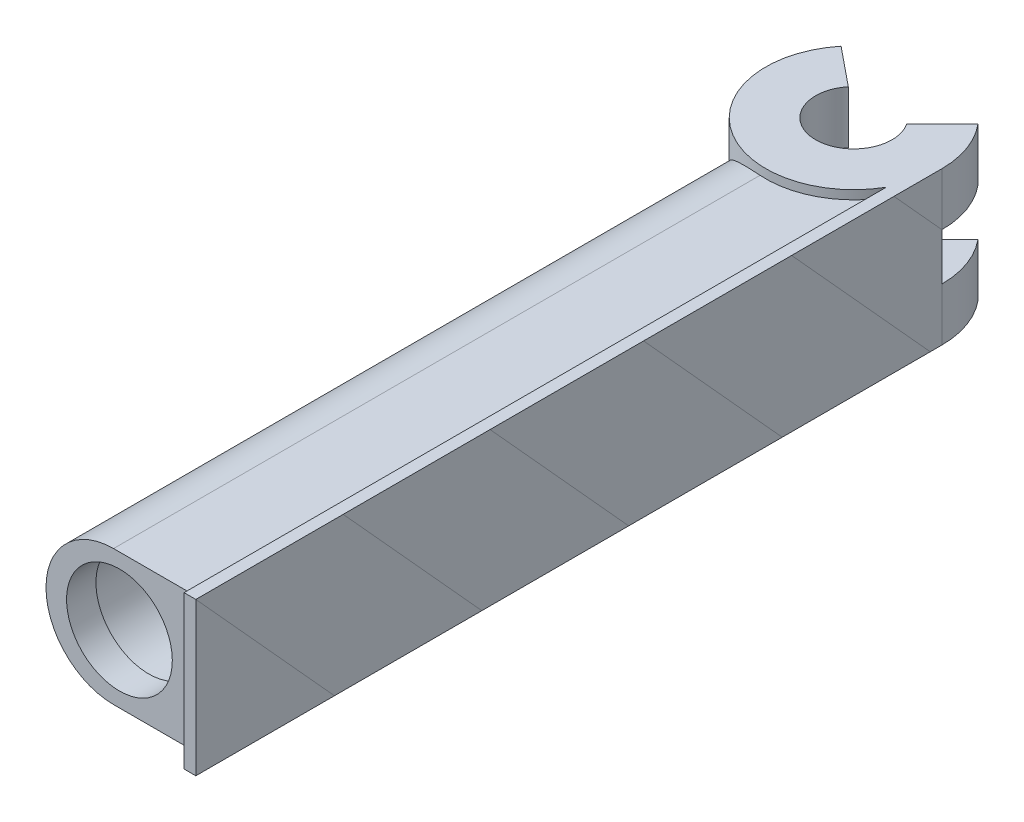
ISO-10303-21;
HEADER;
FILE_DESCRIPTION(('STEP AP214'),'2;1');
FILE_NAME('part.step','',(''),(''),'','','');
FILE_SCHEMA(('AUTOMOTIVE_DESIGN { 1 0 10303 214 1 1 1 1 }'));
ENDSEC;
DATA;
#1=APPLICATION_CONTEXT('core data for automotive mechanical design processes');
#2=APPLICATION_PROTOCOL_DEFINITION('international standard','automotive_design',2000,#1);
#3=PRODUCT_CONTEXT('',#1,'mechanical');
#4=PRODUCT('Part','Part','',(#3));
#5=PRODUCT_RELATED_PRODUCT_CATEGORY('part','',(#4));
#6=PRODUCT_DEFINITION_FORMATION('','',#4);
#7=PRODUCT_DEFINITION_CONTEXT('part definition',#1,'design');
#8=PRODUCT_DEFINITION('design','',#6,#7);
#9=PRODUCT_DEFINITION_SHAPE('','',#8);
#10=(LENGTH_UNIT() NAMED_UNIT(*) SI_UNIT(.MILLI.,.METRE.));
#11=(NAMED_UNIT(*) PLANE_ANGLE_UNIT() SI_UNIT($,.RADIAN.));
#12=(NAMED_UNIT(*) SI_UNIT($,.STERADIAN.) SOLID_ANGLE_UNIT());
#13=UNCERTAINTY_MEASURE_WITH_UNIT(LENGTH_MEASURE(1.E-05),#10,'distance_accuracy_value','');
#14=(GEOMETRIC_REPRESENTATION_CONTEXT(3) GLOBAL_UNCERTAINTY_ASSIGNED_CONTEXT((#13)) GLOBAL_UNIT_ASSIGNED_CONTEXT((#10,
#11,#12)) REPRESENTATION_CONTEXT('',''));
#15=CARTESIAN_POINT('',(0.,0.,0.));
#16=DIRECTION('',(0.,0.,1.));
#17=DIRECTION('',(1.,0.,0.));
#18=AXIS2_PLACEMENT_3D('',#15,#16,#17);
#19=CARTESIAN_POINT('',(0.,26.,0.));
#20=DIRECTION('',(0.,-1.,0.));
#21=DIRECTION('',(0.,0.,-1.));
#22=AXIS2_PLACEMENT_3D('',#19,#20,#21);
#23=CYLINDRICAL_SURFACE('',#22,30.);
#24=CARTESIAN_POINT('',(0.,-26.,0.));
#25=DIRECTION('',(0.,1.,0.));
#26=DIRECTION('',(0.,0.,1.));
#27=AXIS2_PLACEMENT_3D('',#24,#25,#26);
#28=CIRCLE('',#27,30.);
#29=CARTESIAN_POINT('',(30.,-26.,0.));
#30=VERTEX_POINT('',#29);
#31=CARTESIAN_POINT('',(22.9603435149355,-26.,-19.3086153226004));
#32=VERTEX_POINT('',#31);
#33=EDGE_CURVE('E240',#30,#32,#28,.T.);
#34=ORIENTED_EDGE('',*,*,#33,.T.);
#35=DIRECTION('',(0.,1.,0.));
#36=VECTOR('',#35,1.);
#37=CARTESIAN_POINT('',(22.9603435149355,-77.557538277307,-19.3086153226004));
#38=LINE('',#37,#36);
#39=CARTESIAN_POINT('',(22.9603435149355,-8.00000000000004,-19.3086153226004));
#40=VERTEX_POINT('',#39);
#41=EDGE_CURVE('E228',#32,#40,#38,.T.);
#42=ORIENTED_EDGE('',*,*,#41,.T.);
#43=CARTESIAN_POINT('',(0.,-8.,0.));
#44=DIRECTION('',(0.,1.,0.));
#45=DIRECTION('',(0.,0.,1.));
#46=AXIS2_PLACEMENT_3D('',#43,#44,#45);
#47=CIRCLE('',#46,30.);
#48=CARTESIAN_POINT('',(30.,-8.,0.));
#49=VERTEX_POINT('',#48);
#50=EDGE_CURVE('E345',#49,#40,#47,.T.);
#51=ORIENTED_EDGE('',*,*,#50,.F.);
#52=DIRECTION('',(0.,1.,0.));
#53=VECTOR('',#52,1.);
#54=CARTESIAN_POINT('',(30.,26.,0.));
#55=LINE('',#54,#53);
#56=EDGE_CURVE('E405',#30,#49,#55,.T.);
#57=ORIENTED_EDGE('',*,*,#56,.F.);
#58=EDGE_LOOP('',(#34,#42,#51,#57));
#59=FACE_BOUND('',#58,.T.);
#60=ADVANCED_FACE('F53',(#59),#23,.T.);
#61=CARTESIAN_POINT('',(0.,8.,0.));
#62=DIRECTION('',(0.,1.,0.));
#63=DIRECTION('',(0.,0.,1.));
#64=AXIS2_PLACEMENT_3D('',#61,#62,#63);
#65=CIRCLE('',#64,30.);
#66=CARTESIAN_POINT('',(30.,8.00000000000001,0.));
#67=VERTEX_POINT('',#66);
#68=CARTESIAN_POINT('',(22.9603435149355,8.,-19.3086153226004));
#69=VERTEX_POINT('',#68);
#70=EDGE_CURVE('E227',#67,#69,#65,.T.);
#71=ORIENTED_EDGE('',*,*,#70,.T.);
#72=CARTESIAN_POINT('',(22.9603435149355,26.,-19.3086153226004));
#73=VERTEX_POINT('',#72);
#74=EDGE_CURVE('E211',#69,#73,#38,.T.);
#75=ORIENTED_EDGE('',*,*,#74,.T.);
#76=CARTESIAN_POINT('',(0.,26.,0.));
#77=DIRECTION('',(0.,1.,0.));
#78=DIRECTION('',(0.,0.,1.));
#79=AXIS2_PLACEMENT_3D('',#76,#77,#78);
#80=CIRCLE('',#79,30.);
#81=CARTESIAN_POINT('',(30.,26.,0.));
#82=VERTEX_POINT('',#81);
#83=EDGE_CURVE('E225',#82,#73,#80,.T.);
#84=ORIENTED_EDGE('',*,*,#83,.F.);
#85=EDGE_CURVE('E402',#67,#82,#55,.T.);
#86=ORIENTED_EDGE('',*,*,#85,.F.);
#87=EDGE_LOOP('',(#71,#75,#84,#86));
#88=FACE_BOUND('',#87,.T.);
#89=ADVANCED_FACE('F223',(#88),#23,.T.);
#90=CARTESIAN_POINT('',(30.,26.,250.));
#91=DIRECTION('',(-1.,0.,0.));
#92=DIRECTION('',(0.,0.,1.));
#93=AXIS2_PLACEMENT_3D('',#90,#91,#92);
#94=PLANE('',#93);
#95=DIRECTION('',(0.,-0.740455691263407,-0.672105177242096));
#96=VECTOR('',#95,1.);
#97=CARTESIAN_POINT('',(30.,142.284969257166,121.889296184005));
#98=LINE('',#97,#96);
#99=CARTESIAN_POINT('',(30.,26.,16.3384431142877));
#100=VERTEX_POINT('',#99);
#101=EDGE_CURVE('E490',#100,#67,#98,.T.);
#102=ORIENTED_EDGE('',*,*,#101,.F.);
#103=DIRECTION('',(0.,0.,-1.));
#104=VECTOR('',#103,1.);
#105=CARTESIAN_POINT('',(30.,26.,250.));
#106=LINE('',#105,#104);
#107=CARTESIAN_POINT('',(30.,26.,51.1794929681838));
#108=VERTEX_POINT('',#107);
#109=EDGE_CURVE('E527',#108,#100,#106,.T.);
#110=ORIENTED_EDGE('',*,*,#109,.F.);
#111=DIRECTION('',(0.,-0.740455691263407,-0.672105177242096));
#112=VECTOR('',#111,1.);
#113=CARTESIAN_POINT('',(30.,124.945829412569,140.991759926699));
#114=LINE('',#113,#112);
#115=CARTESIAN_POINT('',(30.,-26.,3.97954619357498));
#116=VERTEX_POINT('',#115);
#117=EDGE_CURVE('E487',#108,#116,#114,.T.);
#118=ORIENTED_EDGE('',*,*,#117,.T.);
#119=DIRECTION('',(0.,0.,-1.));
#120=VECTOR('',#119,1.);
#121=CARTESIAN_POINT('',(30.,-26.,250.));
#122=LINE('',#121,#120);
#123=EDGE_CURVE('E418',#116,#30,#122,.T.);
#124=ORIENTED_EDGE('',*,*,#123,.T.);
#125=ORIENTED_EDGE('',*,*,#56,.T.);
#126=EDGE_CURVE('E403',#49,#67,#55,.T.);
#127=ORIENTED_EDGE('',*,*,#126,.T.);
#128=EDGE_LOOP('',(#102,#110,#118,#124,#125,#127));
#129=FACE_BOUND('',#128,.T.);
#130=ADVANCED_FACE('F307',(#129),#94,.F.);
#131=ORIENTED_EDGE('',*,*,#117,.F.);
#132=CARTESIAN_POINT('',(30.,26.,101.57528587291));
#133=VERTEX_POINT('',#132);
#134=EDGE_CURVE('E526',#133,#108,#106,.T.);
#135=ORIENTED_EDGE('',*,*,#134,.F.);
#136=DIRECTION('',(0.,-0.740455691263407,-0.672105177242097));
#137=VECTOR('',#136,1.);
#138=CARTESIAN_POINT('',(30.,99.8656523105951,168.6224946716));
#139=LINE('',#138,#137);
#140=CARTESIAN_POINT('',(30.,-26.,54.3753390983014));
#141=VERTEX_POINT('',#140);
#142=EDGE_CURVE('E484',#133,#141,#139,.T.);
#143=ORIENTED_EDGE('',*,*,#142,.T.);
#144=EDGE_CURVE('E501',#141,#116,#122,.T.);
#145=ORIENTED_EDGE('',*,*,#144,.T.);
#146=EDGE_LOOP('',(#131,#135,#143,#145));
#147=FACE_BOUND('',#146,.T.);
#148=ADVANCED_FACE('F314',(#147),#94,.F.);
#149=ORIENTED_EDGE('',*,*,#142,.F.);
#150=CARTESIAN_POINT('',(30.,26.,153.833181379022));
#151=VERTEX_POINT('',#150);
#152=EDGE_CURVE('E525',#151,#133,#106,.T.);
#153=ORIENTED_EDGE('',*,*,#152,.F.);
#154=DIRECTION('',(0.,-0.740455691263407,-0.672105177242096));
#155=VECTOR('',#154,1.);
#156=CARTESIAN_POINT('',(30.,73.8587735866608,197.274173032646));
#157=LINE('',#156,#155);
#158=CARTESIAN_POINT('',(30.,-26.,106.633234604413));
#159=VERTEX_POINT('',#158);
#160=EDGE_CURVE('E481',#151,#159,#157,.T.);
#161=ORIENTED_EDGE('',*,*,#160,.T.);
#162=EDGE_CURVE('E506',#159,#141,#122,.T.);
#163=ORIENTED_EDGE('',*,*,#162,.T.);
#164=EDGE_LOOP('',(#149,#153,#161,#163));
#165=FACE_BOUND('',#164,.T.);
#166=ADVANCED_FACE('F530',(#165),#94,.F.);
#167=ORIENTED_EDGE('',*,*,#160,.F.);
#168=CARTESIAN_POINT('',(30.,26.,203.833181379022));
#169=VERTEX_POINT('',#168);
#170=EDGE_CURVE('E419',#169,#151,#106,.T.);
#171=ORIENTED_EDGE('',*,*,#170,.F.);
#172=DIRECTION('',(0.,-0.740455691263407,-0.672105177242096));
#173=VECTOR('',#172,1.);
#174=CARTESIAN_POINT('',(30.,48.9755684058353,224.687904568864));
#175=LINE('',#174,#173);
#176=CARTESIAN_POINT('',(30.,-26.,156.633234604413));
#177=VERTEX_POINT('',#176);
#178=EDGE_CURVE('E478',#169,#177,#175,.T.);
#179=ORIENTED_EDGE('',*,*,#178,.T.);
#180=EDGE_CURVE('E507',#177,#159,#122,.T.);
#181=ORIENTED_EDGE('',*,*,#180,.T.);
#182=EDGE_LOOP('',(#167,#171,#179,#181));
#183=FACE_BOUND('',#182,.T.);
#184=ADVANCED_FACE('F529',(#183),#94,.F.);
#185=ORIENTED_EDGE('',*,*,#178,.F.);
#186=CARTESIAN_POINT('',(30.,26.,254.));
#187=VERTEX_POINT('',#186);
#188=EDGE_CURVE('E415',#187,#169,#106,.T.);
#189=ORIENTED_EDGE('',*,*,#188,.F.);
#190=DIRECTION('',(0.,-0.740455691263408,-0.672105177242096));
#191=VECTOR('',#190,1.);
#192=CARTESIAN_POINT('',(30.,24.009343585534,252.193098522898));
#193=LINE('',#192,#191);
#194=CARTESIAN_POINT('',(30.,-26.,206.800053225391));
#195=VERTEX_POINT('',#194);
#196=EDGE_CURVE('E370',#187,#195,#193,.T.);
#197=ORIENTED_EDGE('',*,*,#196,.T.);
#198=EDGE_CURVE('E424',#195,#177,#122,.T.);
#199=ORIENTED_EDGE('',*,*,#198,.T.);
#200=EDGE_LOOP('',(#185,#189,#197,#199));
#201=FACE_BOUND('',#200,.T.);
#202=ADVANCED_FACE('F316',(#201),#94,.F.);
#203=ORIENTED_EDGE('',*,*,#196,.F.);
#204=DIRECTION('',(0.,-1.,0.));
#205=VECTOR('',#204,1.);
#206=CARTESIAN_POINT('',(30.,26.,254.));
#207=LINE('',#206,#205);
#208=CARTESIAN_POINT('',(30.,-26.,254.));
#209=VERTEX_POINT('',#208);
#210=EDGE_CURVE('E363',#187,#209,#207,.T.);
#211=ORIENTED_EDGE('',*,*,#210,.T.);
#212=EDGE_CURVE('E420',#209,#195,#122,.T.);
#213=ORIENTED_EDGE('',*,*,#212,.T.);
#214=EDGE_LOOP('',(#203,#211,#213));
#215=FACE_BOUND('',#214,.T.);
#216=ADVANCED_FACE('F303',(#215),#94,.F.);
#217=CARTESIAN_POINT('',(-2.,0.,250.));
#218=DIRECTION('',(0.,0.,-1.));
#219=DIRECTION('',(-1.,0.,0.));
#220=AXIS2_PLACEMENT_3D('',#217,#218,#219);
#221=PLANE('',#220);
#222=CARTESIAN_POINT('',(0.,0.,250.));
#223=DIRECTION('',(0.,0.,1.));
#224=DIRECTION('',(1.,0.,0.));
#225=AXIS2_PLACEMENT_3D('',#222,#223,#224);
#226=CIRCLE('',#225,18.);
#227=CARTESIAN_POINT('',(18.,0.,250.));
#228=VERTEX_POINT('',#227);
#229=EDGE_CURVE('E355',#228,#228,#226,.T.);
#230=ORIENTED_EDGE('',*,*,#229,.F.);
#231=EDGE_LOOP('',(#230));
#232=FACE_BOUND('',#231,.T.);
#233=DIRECTION('',(0.,-1.,0.));
#234=VECTOR('',#233,1.);
#235=CARTESIAN_POINT('',(26.,26.,250.));
#236=LINE('',#235,#234);
#237=CARTESIAN_POINT('',(26.,23.,250.));
#238=VERTEX_POINT('',#237);
#239=CARTESIAN_POINT('',(26.,-23.,250.));
#240=VERTEX_POINT('',#239);
#241=EDGE_CURVE('E367',#238,#240,#236,.T.);
#242=ORIENTED_EDGE('',*,*,#241,.F.);
#243=DIRECTION('',(-1.,0.,0.));
#244=VECTOR('',#243,1.);
#245=CARTESIAN_POINT('',(-2.,23.,250.));
#246=LINE('',#245,#244);
#247=CARTESIAN_POINT('',(-2.00000000000001,23.,250.));
#248=VERTEX_POINT('',#247);
#249=EDGE_CURVE('E408',#238,#248,#246,.T.);
#250=ORIENTED_EDGE('',*,*,#249,.T.);
#251=CARTESIAN_POINT('',(-2.,0.,250.));
#252=DIRECTION('',(0.,0.,1.));
#253=DIRECTION('',(-1.,0.,0.));
#254=AXIS2_PLACEMENT_3D('',#251,#252,#253);
#255=CIRCLE('',#254,23.);
#256=CARTESIAN_POINT('',(-2.,-23.,250.));
#257=VERTEX_POINT('',#256);
#258=EDGE_CURVE('E410',#248,#257,#255,.T.);
#259=ORIENTED_EDGE('',*,*,#258,.T.);
#260=DIRECTION('',(1.,0.,0.));
#261=VECTOR('',#260,1.);
#262=CARTESIAN_POINT('',(26.,-23.,250.));
#263=LINE('',#262,#261);
#264=EDGE_CURVE('E412',#257,#240,#263,.T.);
#265=ORIENTED_EDGE('',*,*,#264,.T.);
#266=EDGE_LOOP('',(#242,#250,#259,#265));
#267=FACE_BOUND('',#266,.T.);
#268=ADVANCED_FACE('F300',(#232,#267),#221,.F.);
#269=CARTESIAN_POINT('',(-23.2736369469693,-8.,-18.9298130804471));
#270=VERTEX_POINT('',#269);
#271=CARTESIAN_POINT('',(-23.5638586528478,-8.,18.5672982791953));
#272=VERTEX_POINT('',#271);
#273=EDGE_CURVE('E339',#270,#272,#47,.T.);
#274=ORIENTED_EDGE('',*,*,#273,.F.);
#275=DIRECTION('',(0.,1.,0.));
#276=VECTOR('',#275,1.);
#277=CARTESIAN_POINT('',(-23.2736369469693,-77.557538277307,-18.9298130804471));
#278=LINE('',#277,#276);
#279=CARTESIAN_POINT('',(-23.2736369469693,-26.,-18.9298130804471));
#280=VERTEX_POINT('',#279);
#281=EDGE_CURVE('E77',#280,#270,#278,.T.);
#282=ORIENTED_EDGE('',*,*,#281,.F.);
#283=CARTESIAN_POINT('',(26.,-26.,14.9666295470958));
#284=VERTEX_POINT('',#283);
#285=EDGE_CURVE('E246',#280,#284,#28,.T.);
#286=ORIENTED_EDGE('',*,*,#285,.T.);
#287=DIRECTION('',(0.,-1.,0.));
#288=VECTOR('',#287,1.);
#289=CARTESIAN_POINT('',(26.,26.,14.9666295470958));
#290=LINE('',#289,#288);
#291=CARTESIAN_POINT('',(26.,-23.,14.9666295470958));
#292=VERTEX_POINT('',#291);
#293=EDGE_CURVE('E440',#292,#284,#290,.T.);
#294=ORIENTED_EDGE('',*,*,#293,.F.);
#295=CARTESIAN_POINT('',(0.,-23.,0.));
#296=DIRECTION('',(0.,1.,0.));
#297=DIRECTION('',(-1.,0.,0.));
#298=AXIS2_PLACEMENT_3D('',#295,#296,#297);
#299=CIRCLE('',#298,30.);
#300=CARTESIAN_POINT('',(-2.,-23.,29.9332590941915));
#301=VERTEX_POINT('',#300);
#302=EDGE_CURVE('E235',#301,#292,#299,.T.);
#303=ORIENTED_EDGE('',*,*,#302,.F.);
#304=CARTESIAN_POINT('',(-25.,0.,16.583123951777));
#305=CARTESIAN_POINT('',(-24.9999969084999,-0.404391860409273,16.5831317987505));
#306=CARTESIAN_POINT('',(-24.9893070252849,-0.808835476846856,16.5992790008325));
#307=CARTESIAN_POINT('',(-24.9468364833252,-1.61412131052794,16.6630355828786));
#308=CARTESIAN_POINT('',(-24.9150521213389,-2.01496288288905,16.7106504871497));
#309=CARTESIAN_POINT('',(-24.8311405594001,-2.81057914419682,16.8350841693847));
#310=CARTESIAN_POINT('',(-24.7789779750619,-3.20534203216263,16.9119537386022));
#311=CARTESIAN_POINT('',(-24.6554279275674,-3.98595550947442,17.0915683309906));
#312=CARTESIAN_POINT('',(-24.584033561568,-4.37180284467302,17.194322644085));
#313=CARTESIAN_POINT('',(-24.4483655125115,-5.01423549508393,17.386390901835));
#314=CARTESIAN_POINT('',(-24.3888173495588,-5.27359850149702,17.4698993000177));
#315=CARTESIAN_POINT('',(-24.2616235521805,-5.78705822817704,17.6461169897728));
#316=CARTESIAN_POINT('',(-24.1939802446362,-6.04115643724734,17.7388236360827));
#317=CARTESIAN_POINT('',(-23.9793530556328,-6.795708550112,18.029099313703));
#318=CARTESIAN_POINT('',(-23.8207077503598,-7.28825221351236,18.2387724796406));
#319=CARTESIAN_POINT('',(-23.4743535982928,-8.25322988047006,18.6824568185579));
#320=CARTESIAN_POINT('',(-23.2865648407837,-8.72560389673541,18.9165343104311));
#321=CARTESIAN_POINT('',(-22.8839515607127,-9.64958444087979,19.4016521715803));
#322=CARTESIAN_POINT('',(-22.6691277186798,-10.1011914911156,19.6526921138027));
#323=CARTESIAN_POINT('',(-22.2725554425529,-10.8701015042518,20.0997032818435));
#324=CARTESIAN_POINT('',(-22.0966265811876,-11.1919261612332,20.2931207724248));
#325=CARTESIAN_POINT('',(-21.7308546005719,-11.8248447398738,20.6843351426875));
#326=CARTESIAN_POINT('',(-21.5410102844584,-12.1359377351147,20.8821323980475));
#327=CARTESIAN_POINT('',(-20.9508077086762,-13.0535962923796,21.4796827605872));
#328=CARTESIAN_POINT('',(-20.5298393628614,-13.6444264455209,21.8835263152126));
#329=CARTESIAN_POINT('',(-19.6343186960033,-14.7836173170913,22.6904616937574));
#330=CARTESIAN_POINT('',(-19.159796984584,-15.3320019970089,23.0935538145765));
#331=CARTESIAN_POINT('',(-18.1572369562175,-16.3851108853407,23.8898366337976));
#332=CARTESIAN_POINT('',(-17.6292170882665,-16.8898500345028,24.2830306875733));
#333=CARTESIAN_POINT('',(-16.619000352774,-17.7665001619524,24.9823127476461));
#334=CARTESIAN_POINT('',(-16.1454793312362,-18.1460284208634,25.2914094231859));
#335=CARTESIAN_POINT('',(-15.1627295507501,-18.8710180261536,25.8925339243917));
#336=CARTESIAN_POINT('',(-14.6535014377994,-19.2164799885741,26.1845620586794));
#337=CARTESIAN_POINT('',(-13.6008947488468,-19.8696334843786,26.7464222205438));
#338=CARTESIAN_POINT('',(-13.0575650285076,-20.177377267802,27.0162847784931));
#339=CARTESIAN_POINT('',(-11.9376638961835,-20.7518343357419,27.5294623618009));
#340=CARTESIAN_POINT('',(-11.3610990701074,-21.0185557111437,27.7727826193608));
#341=CARTESIAN_POINT('',(-10.2843944102509,-21.4626160249685,28.1868968445652));
#342=CARTESIAN_POINT('',(-9.7892976465013,-21.647395819619,28.3628481646556));
#343=CARTESIAN_POINT('',(-8.78049462224423,-21.9842572921652,28.6911860057779));
#344=CARTESIAN_POINT('',(-8.2667903809955,-22.1363425056856,28.8435750743542));
#345=CARTESIAN_POINT('',(-7.22356677652599,-22.4054546342475,29.1223531524536));
#346=CARTESIAN_POINT('',(-6.69405354360841,-22.5224949494722,29.2487520940632));
#347=CARTESIAN_POINT('',(-5.62228200891144,-22.7195050392317,29.4735424673486));
#348=CARTESIAN_POINT('',(-5.08002355374876,-22.7994743673928,29.5719335617749));
#349=CARTESIAN_POINT('',(-3.98405781819668,-22.9209268369254,29.7394686754605));
#350=CARTESIAN_POINT('',(-3.43030855946204,-22.9622264145305,29.8084723585779));
#351=CARTESIAN_POINT('',(-2.31827379363934,-23.0045274381688,29.9155077576999));
#352=CARTESIAN_POINT('',(-1.75998827537907,-23.0055287849227,29.9535393974009));
#353=CARTESIAN_POINT('',(-0.643632311453427,-22.9667625742224,29.9982963385349));
#354=CARTESIAN_POINT('',(-0.0855618503096781,-22.9269989217319,30.0050246382375));
#355=CARTESIAN_POINT('',(1.02569041271261,-22.8069614336651,29.9876095620428));
#356=CARTESIAN_POINT('',(1.57887243115139,-22.7266894018757,29.9634675606875));
#357=CARTESIAN_POINT('',(2.63427800187295,-22.534175911841,29.888442017219));
#358=CARTESIAN_POINT('',(3.13718712092688,-22.4248172057208,29.839722993466));
#359=CARTESIAN_POINT('',(4.13179130847679,-22.1735025514076,29.7183323189304));
#360=CARTESIAN_POINT('',(4.62348705768615,-22.031548587748,29.6456621262763));
#361=CARTESIAN_POINT('',(5.59294321374261,-21.7165154878687,29.4781448600337));
#362=CARTESIAN_POINT('',(6.07070230434479,-21.5434334227517,29.3832956993351));
#363=CARTESIAN_POINT('',(7.00993707314299,-21.1678269012118,29.1734876266108));
#364=CARTESIAN_POINT('',(7.47141182099344,-20.9653007659845,29.0585275678515));
#365=CARTESIAN_POINT('',(8.4075067911094,-20.517584849303,28.8021758147994));
#366=CARTESIAN_POINT('',(8.880827680732,-20.2704128098468,28.6595057273285));
#367=CARTESIAN_POINT('',(9.80493995663752,-19.7465329345192,28.3566506479143));
#368=CARTESIAN_POINT('',(10.2557305514631,-19.4698240621298,28.1964650413049));
#369=CARTESIAN_POINT('',(11.1336563593822,-18.8887347265996,27.8614882540927));
#370=CARTESIAN_POINT('',(11.5607820616436,-18.5843432658965,27.6866912710249));
#371=CARTESIAN_POINT('',(12.3902704640913,-17.949732098312,27.3255535743004));
#372=CARTESIAN_POINT('',(12.792630124495,-17.6195092321361,27.1392114492035));
#373=CARTESIAN_POINT('',(13.6412725759139,-16.8737670363104,26.7240853062683));
#374=CARTESIAN_POINT('',(14.0826132510706,-16.4535316411891,26.4936536007179));
#375=CARTESIAN_POINT('',(14.9289938037871,-15.5813524647535,26.0261203526379));
#376=CARTESIAN_POINT('',(15.3340285225146,-15.1294041934672,25.7890178685045));
#377=CARTESIAN_POINT('',(16.1072198166262,-14.1949528579215,25.3133098964159));
#378=CARTESIAN_POINT('',(16.4753431779108,-13.7124229011357,25.0747032565349));
#379=CARTESIAN_POINT('',(17.1732313094945,-12.7183326512807,24.6019857936688));
#380=CARTESIAN_POINT('',(17.502999682122,-12.2067750912306,24.3678745501998));
#381=CARTESIAN_POINT('',(18.0998676130669,-11.1943989016269,23.927432145242));
#382=CARTESIAN_POINT('',(18.3697989758664,-10.6955874609367,23.7203273122392));
#383=CARTESIAN_POINT('',(18.8741271037257,-9.6744533230592,23.3210371472899));
#384=CARTESIAN_POINT('',(19.1085224978306,-9.15212971979546,23.1288523910899));
#385=CARTESIAN_POINT('',(19.5394634574702,-8.08588915966983,22.7659532157833));
#386=CARTESIAN_POINT('',(19.7360700955824,-7.54200878781259,22.5952043105743));
#387=CARTESIAN_POINT('',(20.0895006778755,-6.43366101809706,22.2815593040578));
#388=CARTESIAN_POINT('',(20.2463356903567,-5.86919939805278,22.138655456141));
#389=CARTESIAN_POINT('',(20.4901017028854,-4.83899496281234,21.912951505098));
#390=CARTESIAN_POINT('',(20.5847594316099,-4.37645702384061,21.8238395261473));
#391=CARTESIAN_POINT('',(20.7458683222395,-3.44237840542505,21.6707487519141));
#392=CARTESIAN_POINT('',(20.8123231557017,-2.97083890619486,21.6067666852077));
#393=CARTESIAN_POINT('',(20.9158980573504,-2.02213465983438,21.5065207597892));
#394=CARTESIAN_POINT('',(20.9530510038822,-1.54497682892994,21.4702258360678));
#395=CARTESIAN_POINT('',(20.9974739114316,-0.587922607725106,21.426784077034));
#396=CARTESIAN_POINT('',(21.0047435264456,-0.10802618578041,21.4196375792163));
#397=CARTESIAN_POINT('',(20.9892537374136,0.851138431695859,21.4348160259019));
#398=CARTESIAN_POINT('',(20.9664736509524,1.33040596703596,21.4571612687962));
#399=CARTESIAN_POINT('',(20.8912775276442,2.28437713051761,21.5303795586915));
#400=CARTESIAN_POINT('',(20.8388615841071,2.759080773024,21.5812525158716));
#401=CARTESIAN_POINT('',(20.7052077632548,3.70139504223099,21.7095121107362));
#402=CARTESIAN_POINT('',(20.623931604318,4.1689953835232,21.7869339594879));
#403=CARTESIAN_POINT('',(20.433784916763,5.09395133635147,21.9653678550484));
#404=CARTESIAN_POINT('',(20.3249106169365,5.55130553847796,22.0663831256837));
#405=CARTESIAN_POINT('',(20.0430585568613,6.5938283934403,22.3231389928425));
#406=CARTESIAN_POINT('',(19.86067132205,7.1746779820782,22.4861373899462));
#407=CARTESIAN_POINT('',(19.4536965490301,8.31291499163232,22.8391367828579));
#408=CARTESIAN_POINT('',(19.2290950614554,8.87029458233854,23.0291466993378));
#409=CARTESIAN_POINT('',(18.7398404639462,9.96075561699938,23.4290058167281));
#410=CARTESIAN_POINT('',(18.475130190045,10.4938009451816,23.6388831703502));
#411=CARTESIAN_POINT('',(17.9078659538014,11.5337641142509,24.0714678202619));
#412=CARTESIAN_POINT('',(17.6053149102342,12.0406839660227,24.294174126301));
#413=CARTESIAN_POINT('',(16.9557951199268,13.0400059841885,24.7520262296585));
#414=CARTESIAN_POINT('',(16.6079072773335,13.5317314435133,24.9873437212951));
#415=CARTESIAN_POINT('',(15.8750113384696,14.4860602123952,25.4592616968211));
#416=CARTESIAN_POINT('',(15.4900018736537,14.9486624472401,25.695862227708));
#417=CARTESIAN_POINT('',(14.6840590818146,15.8431149945134,26.1647783925261));
#418=CARTESIAN_POINT('',(14.2631511506919,16.2749866565947,26.3970969165147));
#419=CARTESIAN_POINT('',(13.3860421355779,17.106573587561,26.8525238391673));
#420=CARTESIAN_POINT('',(12.9298427810668,17.506290430259,27.075632688337));
#421=CARTESIAN_POINT('',(12.0035507170889,18.2548537221136,27.4984123373608));
#422=CARTESIAN_POINT('',(11.534903249838,18.6051498580144,27.6986787886368));
#423=CARTESIAN_POINT('',(10.567458406401,19.2718446899996,28.0820132941554));
#424=CARTESIAN_POINT('',(10.0686652878873,19.5882481555537,28.2650837678157));
#425=CARTESIAN_POINT('',(9.04260597914621,20.1844703894598,28.6098607220447));
#426=CARTESIAN_POINT('',(8.51534174729988,20.4642916695937,28.7715686694011));
#427=CARTESIAN_POINT('',(7.43470054789466,20.984421367382,29.0695598706205));
#428=CARTESIAN_POINT('',(6.88132379809729,21.2247301144704,29.2058433364602));
#429=CARTESIAN_POINT('',(5.74690105725066,21.6646877318138,29.4501705030967));
#430=CARTESIAN_POINT('',(5.16566045709048,21.8639750942447,29.5579653188251));
#431=CARTESIAN_POINT('',(3.98419350540359,22.2164212375011,29.7402654512815));
#432=CARTESIAN_POINT('',(3.38396692520101,22.3695794624921,29.8147703668871));
#433=CARTESIAN_POINT('',(2.17033413509507,22.6272574439374,29.9275909864285));
#434=CARTESIAN_POINT('',(1.55693995701822,22.7318197780867,29.9659384004874));
#435=CARTESIAN_POINT('',(0.322540505575984,22.890890679977,30.0046173185638));
#436=CARTESIAN_POINT('',(-0.298463563723394,22.9454070651491,30.0049547609342));
#437=CARTESIAN_POINT('',(-1.45296525992114,22.9996876061283,29.9695420642053));
#438=CARTESIAN_POINT('',(-1.9863230429707,23.0061466016856,29.9389272507853));
#439=CARTESIAN_POINT('',(-3.04976994362577,22.9821835630557,29.8493472472413));
#440=CARTESIAN_POINT('',(-3.57985942797196,22.9517657454611,29.790385298869));
#441=CARTESIAN_POINT('',(-4.63286776015827,22.8549251383502,29.6448829529522));
#442=CARTESIAN_POINT('',(-5.15578679357701,22.7885032824654,29.5583432705583));
#443=CARTESIAN_POINT('',(-6.19094735637204,22.6210276260631,29.3589854548077));
#444=CARTESIAN_POINT('',(-6.70318847608479,22.5199724994073,29.2461663152406));
#445=CARTESIAN_POINT('',(-7.7055085805683,22.2869365468531,28.9980567639947));
#446=CARTESIAN_POINT('',(-8.19581429344615,22.1554968667056,28.8631704121713));
#447=CARTESIAN_POINT('',(-9.16069213722405,21.862723633056,28.5715898338653));
#448=CARTESIAN_POINT('',(-9.63526495900615,21.7013913942883,28.4148965665696));
#449=CARTESIAN_POINT('',(-10.5669147391386,21.3507789704273,28.0817576305232));
#450=CARTESIAN_POINT('',(-11.0239879439186,21.1614928312021,27.9053077555905));
#451=CARTESIAN_POINT('',(-11.9191733317298,20.7569594412956,27.5348523336946));
#452=CARTESIAN_POINT('',(-12.3572817657365,20.5417070890788,27.3408433387983));
#453=CARTESIAN_POINT('',(-13.3893806647531,19.9937374633466,26.854608797346));
#454=CARTESIAN_POINT('',(-13.9734943036331,19.6490848865369,26.5547700392061));
#455=CARTESIAN_POINT('',(-15.1001783188955,18.9165856177085,25.9306713750601));
#456=CARTESIAN_POINT('',(-15.6427339685101,18.5287237321595,25.6064028919772));
#457=CARTESIAN_POINT('',(-16.6864677337545,17.7129143781635,24.9388512747451));
#458=CARTESIAN_POINT('',(-17.1875559450539,17.2848838955056,24.5955293897299));
#459=CARTESIAN_POINT('',(-18.1467147234561,16.3924598486416,23.8966278766439));
#460=CARTESIAN_POINT('',(-18.6047901442007,15.9280703981188,23.5410496378077));
#461=CARTESIAN_POINT('',(-19.4849654310937,14.9570178739143,22.8180983403931));
#462=CARTESIAN_POINT('',(-19.9063643590389,14.4497929592023,22.4506275355252));
#463=CARTESIAN_POINT('',(-20.7045924236545,13.4004825065337,21.7166701995927));
#464=CARTESIAN_POINT('',(-21.0814113582329,12.8583890325857,21.3501839125155));
#465=CARTESIAN_POINT('',(-21.7891829767334,11.7399218133518,20.6273355707018));
#466=CARTESIAN_POINT('',(-22.1201953551362,11.1635941094588,20.2709608298121));
#467=CARTESIAN_POINT('',(-22.7352271476857,9.97486497028381,19.5786448469869));
#468=CARTESIAN_POINT('',(-23.0192731178577,9.36248418782376,19.2426921263387));
#469=CARTESIAN_POINT('',(-23.4351454417172,8.34895485335179,18.7311522971208));
#470=CARTESIAN_POINT('',(-23.5828126800658,7.9597938095263,18.5445906158235));
#471=CARTESIAN_POINT('',(-23.858820198784,7.16715343107269,18.1881123856845));
#472=CARTESIAN_POINT('',(-23.9871609866608,6.76367447277292,18.0181953997986));
#473=CARTESIAN_POINT('',(-24.2229236641662,5.94334784143983,17.6999755780962));
#474=CARTESIAN_POINT('',(-24.3303908465967,5.52653145237034,17.551626123862));
#475=CARTESIAN_POINT('',(-24.523134106502,4.67941286482025,17.2813051283459));
#476=CARTESIAN_POINT('',(-24.6084176415032,4.24911525299809,17.1593247248568));
#477=CARTESIAN_POINT('',(-24.7337298175682,3.50370203516126,16.9779554218793));
#478=CARTESIAN_POINT('',(-24.7797062297818,3.1914912761457,16.9106808730103));
#479=CARTESIAN_POINT('',(-24.8590373297732,2.56221069103888,16.7938460908956));
#480=CARTESIAN_POINT('',(-24.8923946358664,2.24514188715618,16.7442821830197));
#481=CARTESIAN_POINT('',(-24.9459766517107,1.60761267812654,16.6643506442116));
#482=CARTESIAN_POINT('',(-24.9662071791928,1.28715383951575,16.6339745095004));
#483=CARTESIAN_POINT('',(-24.9932185552532,0.644474010971369,16.5933603273745));
#484=CARTESIAN_POINT('',(-25.0000024635672,0.322253438652186,16.5831176986486));
#485=CARTESIAN_POINT('',(-25.,0.,16.583123951777));
#486=B_SPLINE_CURVE_WITH_KNOTS('',3,(#304,#305,#306,#307,#308,#309,#310,#311,#312,#313,#314,
#315,#316,#317,#318,#319,#320,#321,#322,#323,#324,#325,#326,#327,#328,#329,#330,#331,#332,#333,
#334,#335,#336,#337,#338,#339,#340,#341,#342,#343,#344,#345,#346,#347,#348,#349,#350,#351,#352,
#353,#354,#355,#356,#357,#358,#359,#360,#361,#362,#363,#364,#365,#366,#367,#368,#369,#370,#371,
#372,#373,#374,#375,#376,#377,#378,#379,#380,#381,#382,#383,#384,#385,#386,#387,#388,#389,#390,
#391,#392,#393,#394,#395,#396,#397,#398,#399,#400,#401,#402,#403,#404,#405,#406,#407,#408,#409,
#410,#411,#412,#413,#414,#415,#416,#417,#418,#419,#420,#421,#422,#423,#424,#425,#426,#427,#428,
#429,#430,#431,#432,#433,#434,#435,#436,#437,#438,#439,#440,#441,#442,#443,#444,#445,#446,#447,
#448,#449,#450,#451,#452,#453,#454,#455,#456,#457,#458,#459,#460,#461,#462,#463,#464,#465,#466,
#467,#468,#469,#470,#471,#472,#473,#474,#475,#476,#477,#478,#479,#480,#481,#482,#483,#484,#485),
.UNSPECIFIED.,.T.,.F.,(4,2,2,2,2,2,2,2,2,2,2,2,2,2,2,2,2,2,2,2,2,2,2,2,2,2,2,2,2,2,2,2,2,2,2,2,
2,2,2,2,2,2,2,2,2,2,2,2,2,2,2,2,2,2,2,2,2,2,2,2,2,2,2,2,2,2,2,2,2,2,2,2,2,2,2,2,2,2,2,2,2,2,2,2,
2,2,2,2,2,2,4),(0.,1.21281510407382,2.42584318027242,3.6409869662718,4.8565674850406,
5.69297263117093,6.52913793451408,8.20200382703086,9.87954047921589,11.5570349127858,
12.8005841638337,14.0442404978816,16.5319907000267,19.0183261063104,21.503806992188,
23.5450838582907,25.5863238039874,27.6247033212839,29.6626802902277,31.331981416573,
33.0011019321203,34.6695834055176,36.3380849686671,38.0144672750943,39.6908537114863,
41.3670795783615,43.043230811607,44.5923960366261,46.1414669670867,47.6906837286558,
49.2399888561565,50.8964803298632,52.5530299529265,54.2102405784989,55.8676542060613,
57.8202887797833,59.7732003713694,61.7278537795607,63.6823234567838,65.4921449159271,
67.3020361790589,69.1089773134713,70.9154150294398,72.3553690257591,73.7951355059992,
75.2332841807232,76.6714495069803,78.1106052010647,79.5497563639253,80.9908236634698,
82.4320879870653,84.3200498892562,86.2086367538646,88.0999410442652,89.991099542395,
91.929391693936,93.8677553309239,95.8047588950035,97.7416675949656,99.5951319996672,
101.448335236159,103.301411162329,105.154471637774,107.023222510331,108.89199589956,
110.759128846254,112.62597008766,114.226802142092,115.827451170404,117.428058693785,
119.028727512679,120.602828385983,122.176860043625,123.751227452105,125.325904679052,
127.547300759188,129.769480420868,131.996358154253,134.222984299952,136.485590481768,
138.748713461474,141.008858822374,143.267721835731,144.635350027884,146.002942300237,
147.367533099292,148.731664566193,149.698987352677,150.666109320883,151.632802371546,
152.599275428994),.UNSPECIFIED.);
#487=EDGE_CURVE('E238',#272,#301,#486,.T.);
#488=ORIENTED_EDGE('',*,*,#487,.F.);
#489=EDGE_LOOP('',(#274,#282,#286,#294,#303,#488));
#490=FACE_BOUND('',#489,.T.);
#491=ADVANCED_FACE('F302',(#490),#23,.T.);
#492=CARTESIAN_POINT('',(0.,-26.,0.));
#493=DIRECTION('',(0.,1.,0.));
#494=DIRECTION('',(0.,0.,1.));
#495=AXIS2_PLACEMENT_3D('',#492,#493,#494);
#496=CYLINDRICAL_SURFACE('',#495,13.);
#497=CARTESIAN_POINT('',(0.,-8.,0.));
#498=DIRECTION('',(0.,1.,0.));
#499=DIRECTION('',(0.,0.,1.));
#500=AXIS2_PLACEMENT_3D('',#497,#498,#499);
#501=CIRCLE('',#500,13.);
#502=CARTESIAN_POINT('',(10.8350938247474,-8.,-7.18336563241222));
#503=VERTEX_POINT('',#502);
#504=CARTESIAN_POINT('',(-10.08524267702,-8.00000000000004,-8.2029190015271));
#505=VERTEX_POINT('',#504);
#506=EDGE_CURVE('E281',#503,#505,#501,.F.);
#507=ORIENTED_EDGE('',*,*,#506,.F.);
#508=DIRECTION('',(0.,1.,0.));
#509=VECTOR('',#508,1.);
#510=CARTESIAN_POINT('',(10.8350938247474,-77.557538277307,-7.18336563241222));
#511=LINE('',#510,#509);
#512=CARTESIAN_POINT('',(10.8350938247474,-26.,-7.18336563241222));
#513=VERTEX_POINT('',#512);
#514=EDGE_CURVE('E69',#513,#503,#511,.T.);
#515=ORIENTED_EDGE('',*,*,#514,.F.);
#516=CARTESIAN_POINT('',(0.,-26.,0.));
#517=DIRECTION('',(0.,1.,0.));
#518=DIRECTION('',(0.,0.,1.));
#519=AXIS2_PLACEMENT_3D('',#516,#517,#518);
#520=CIRCLE('',#519,13.);
#521=CARTESIAN_POINT('',(-10.08524267702,-26.,-8.20291900152709));
#522=VERTEX_POINT('',#521);
#523=EDGE_CURVE('E283',#522,#513,#520,.T.);
#524=ORIENTED_EDGE('',*,*,#523,.F.);
#525=DIRECTION('',(0.,1.,0.));
#526=VECTOR('',#525,1.);
#527=CARTESIAN_POINT('',(-10.08524267702,-77.557538277307,-8.2029190015271));
#528=LINE('',#527,#526);
#529=EDGE_CURVE('E386',#522,#505,#528,.T.);
#530=ORIENTED_EDGE('',*,*,#529,.T.);
#531=EDGE_LOOP('',(#507,#515,#524,#530));
#532=FACE_BOUND('',#531,.T.);
#533=ADVANCED_FACE('F299',(#532),#496,.F.);
#534=CARTESIAN_POINT('',(-23.2736369469693,26.,-18.9298130804471));
#535=VERTEX_POINT('',#534);
#536=CARTESIAN_POINT('',(26.,26.,14.9666295470958));
#537=VERTEX_POINT('',#536);
#538=EDGE_CURVE('E236',#535,#537,#80,.T.);
#539=ORIENTED_EDGE('',*,*,#538,.F.);
#540=CARTESIAN_POINT('',(-23.2736369469693,7.99999999999998,-18.9298130804471));
#541=VERTEX_POINT('',#540);
#542=EDGE_CURVE('E383',#541,#535,#278,.T.);
#543=ORIENTED_EDGE('',*,*,#542,.F.);
#544=CARTESIAN_POINT('',(-23.5638586528478,8.,18.5672982791953));
#545=VERTEX_POINT('',#544);
#546=EDGE_CURVE('E461',#541,#545,#65,.T.);
#547=ORIENTED_EDGE('',*,*,#546,.T.);
#548=CARTESIAN_POINT('',(-2.00000000000001,23.,29.9332590941915));
#549=VERTEX_POINT('',#548);
#550=EDGE_CURVE('E248',#549,#545,#486,.T.);
#551=ORIENTED_EDGE('',*,*,#550,.F.);
#552=CARTESIAN_POINT('',(0.,23.,0.));
#553=DIRECTION('',(0.,-1.,0.));
#554=DIRECTION('',(1.,0.,0.));
#555=AXIS2_PLACEMENT_3D('',#552,#553,#554);
#556=CIRCLE('',#555,30.);
#557=CARTESIAN_POINT('',(26.,23.,14.9666295470958));
#558=VERTEX_POINT('',#557);
#559=EDGE_CURVE('E255',#558,#549,#556,.T.);
#560=ORIENTED_EDGE('',*,*,#559,.F.);
#561=DIRECTION('',(0.,-1.,0.));
#562=VECTOR('',#561,1.);
#563=CARTESIAN_POINT('',(26.,26.,14.9666295470958));
#564=LINE('',#563,#562);
#565=EDGE_CURVE('E243',#537,#558,#564,.T.);
#566=ORIENTED_EDGE('',*,*,#565,.F.);
#567=EDGE_LOOP('',(#539,#543,#547,#551,#560,#566));
#568=FACE_BOUND('',#567,.T.);
#569=ADVANCED_FACE('F55',(#568),#23,.T.);
#570=CARTESIAN_POINT('',(0.,26.,0.));
#571=DIRECTION('',(0.,1.,0.));
#572=DIRECTION('',(0.,0.,1.));
#573=AXIS2_PLACEMENT_3D('',#570,#571,#572);
#574=PLANE('',#573);
#575=DIRECTION('',(0.707106781186546,0.,-0.707106781186549));
#576=VECTOR('',#575,1.);
#577=CARTESIAN_POINT('',(10.8350938247474,26.,-7.18336563241222));
#578=LINE('',#577,#576);
#579=CARTESIAN_POINT('',(10.8350938247474,26.,-7.18336563241222));
#580=VERTEX_POINT('',#579);
#581=EDGE_CURVE('E208',#580,#73,#578,.T.);
#582=ORIENTED_EDGE('',*,*,#581,.F.);
#583=CARTESIAN_POINT('',(0.,26.,0.));
#584=DIRECTION('',(0.,1.,0.));
#585=DIRECTION('',(0.,0.,1.));
#586=AXIS2_PLACEMENT_3D('',#583,#584,#585);
#587=CIRCLE('',#586,13.);
#588=CARTESIAN_POINT('',(-10.08524267702,26.,-8.2029190015271));
#589=VERTEX_POINT('',#588);
#590=EDGE_CURVE('E280',#589,#580,#587,.T.);
#591=ORIENTED_EDGE('',*,*,#590,.F.);
#592=DIRECTION('',(0.775787898232309,0.,0.630993769348238));
#593=VECTOR('',#592,1.);
#594=CARTESIAN_POINT('',(-23.2736369469693,26.,-18.9298130804471));
#595=LINE('',#594,#593);
#596=EDGE_CURVE('E218',#535,#589,#595,.T.);
#597=ORIENTED_EDGE('',*,*,#596,.F.);
#598=ORIENTED_EDGE('',*,*,#538,.T.);
#599=DIRECTION('',(0.,0.,-1.));
#600=VECTOR('',#599,1.);
#601=CARTESIAN_POINT('',(26.,26.,250.));
#602=LINE('',#601,#600);
#603=CARTESIAN_POINT('',(26.,26.,254.));
#604=VERTEX_POINT('',#603);
#605=EDGE_CURVE('E438',#604,#537,#602,.T.);
#606=ORIENTED_EDGE('',*,*,#605,.F.);
#607=DIRECTION('',(1.,0.,0.));
#608=VECTOR('',#607,1.);
#609=CARTESIAN_POINT('',(26.,26.,254.));
#610=LINE('',#609,#608);
#611=EDGE_CURVE('E366',#604,#187,#610,.T.);
#612=ORIENTED_EDGE('',*,*,#611,.T.);
#613=ORIENTED_EDGE('',*,*,#188,.T.);
#614=ORIENTED_EDGE('',*,*,#170,.T.);
#615=ORIENTED_EDGE('',*,*,#152,.T.);
#616=ORIENTED_EDGE('',*,*,#134,.T.);
#617=ORIENTED_EDGE('',*,*,#109,.T.);
#618=EDGE_CURVE('E233',#100,#82,#106,.T.);
#619=ORIENTED_EDGE('',*,*,#618,.T.);
#620=ORIENTED_EDGE('',*,*,#83,.T.);
#621=EDGE_LOOP('',(#582,#591,#597,#598,#606,#612,#613,#614,#615,#616,#617,#619,#620));
#622=FACE_BOUND('',#621,.T.);
#623=ADVANCED_FACE('F230',(#622),#574,.T.);
#624=CARTESIAN_POINT('',(0.,-26.,0.));
#625=DIRECTION('',(0.,1.,0.));
#626=DIRECTION('',(0.,0.,1.));
#627=AXIS2_PLACEMENT_3D('',#624,#625,#626);
#628=PLANE('',#627);
#629=ORIENTED_EDGE('',*,*,#523,.T.);
#630=DIRECTION('',(-0.707106781186546,0.,0.707106781186549));
#631=VECTOR('',#630,1.);
#632=CARTESIAN_POINT('',(10.8350938247474,-26.,-7.18336563241222));
#633=LINE('',#632,#631);
#634=EDGE_CURVE('E380',#32,#513,#633,.T.);
#635=ORIENTED_EDGE('',*,*,#634,.F.);
#636=ORIENTED_EDGE('',*,*,#33,.F.);
#637=ORIENTED_EDGE('',*,*,#123,.F.);
#638=ORIENTED_EDGE('',*,*,#144,.F.);
#639=ORIENTED_EDGE('',*,*,#162,.F.);
#640=ORIENTED_EDGE('',*,*,#180,.F.);
#641=ORIENTED_EDGE('',*,*,#198,.F.);
#642=ORIENTED_EDGE('',*,*,#212,.F.);
#643=DIRECTION('',(1.,0.,0.));
#644=VECTOR('',#643,1.);
#645=CARTESIAN_POINT('',(26.,-26.,254.));
#646=LINE('',#645,#644);
#647=CARTESIAN_POINT('',(26.,-26.,254.));
#648=VERTEX_POINT('',#647);
#649=EDGE_CURVE('E372',#648,#209,#646,.T.);
#650=ORIENTED_EDGE('',*,*,#649,.F.);
#651=DIRECTION('',(0.,0.,-1.));
#652=VECTOR('',#651,1.);
#653=CARTESIAN_POINT('',(26.,-26.,250.));
#654=LINE('',#653,#652);
#655=EDGE_CURVE('E423',#648,#284,#654,.T.);
#656=ORIENTED_EDGE('',*,*,#655,.T.);
#657=ORIENTED_EDGE('',*,*,#285,.F.);
#658=DIRECTION('',(-0.775787898232309,0.,-0.630993769348238));
#659=VECTOR('',#658,1.);
#660=CARTESIAN_POINT('',(-23.2736369469693,-26.,-18.9298130804471));
#661=LINE('',#660,#659);
#662=EDGE_CURVE('E390',#522,#280,#661,.T.);
#663=ORIENTED_EDGE('',*,*,#662,.F.);
#664=EDGE_LOOP('',(#629,#635,#636,#637,#638,#639,#640,#641,#642,#650,#656,#657,#663));
#665=FACE_BOUND('',#664,.T.);
#666=ADVANCED_FACE('F263',(#665),#628,.F.);
#667=CARTESIAN_POINT('',(-2.,0.,250.));
#668=DIRECTION('',(0.,0.,-1.));
#669=DIRECTION('',(-1.,0.,0.));
#670=AXIS2_PLACEMENT_3D('',#667,#668,#669);
#671=CYLINDRICAL_SURFACE('',#670,23.);
#672=DIRECTION('',(0.,0.,-1.));
#673=VECTOR('',#672,1.);
#674=CARTESIAN_POINT('',(-2.00000000000001,23.,250.));
#675=LINE('',#674,#673);
#676=EDGE_CURVE('E432',#248,#549,#675,.T.);
#677=ORIENTED_EDGE('',*,*,#676,.T.);
#678=ORIENTED_EDGE('',*,*,#550,.T.);
#679=CARTESIAN_POINT('',(-23.5638586528478,8.,18.5672982791953));
#680=CARTESIAN_POINT('',(-23.6970786546595,7.64086598786438,18.3982621409826));
#681=CARTESIAN_POINT('',(-23.8223830364675,7.27563567612146,18.2354586988018));
#682=CARTESIAN_POINT('',(-24.0562445835567,6.53255172091618,17.9258053329078));
#683=CARTESIAN_POINT('',(-24.1647752481775,6.15467922694187,17.778980760178));
#684=CARTESIAN_POINT('',(-24.364650592328,5.3835288326477,17.5040864498352));
#685=CARTESIAN_POINT('',(-24.4558307520627,4.99014241841377,17.3761985780172));
#686=CARTESIAN_POINT('',(-24.6183659638315,4.19227504524653,17.1451457858103));
#687=CARTESIAN_POINT('',(-24.6897296533972,3.7877990047559,17.0419700966684));
#688=CARTESIAN_POINT('',(-24.8119358839761,2.96486356771664,16.8635620760182));
#689=CARTESIAN_POINT('',(-24.8625462942376,2.54629981505182,16.7886465464522));
#690=CARTESIAN_POINT('',(-24.94082675442,1.70234907164904,16.672136961693));
#691=CARTESIAN_POINT('',(-24.9684963223272,1.27696193773533,16.6305436066381));
#692=CARTESIAN_POINT('',(-24.9999829606112,0.425659048232727,16.5831746120248));
#693=CARTESIAN_POINT('',(-25.003931491227,-0.000240685863596587,16.5772015686814));
#694=CARTESIAN_POINT('',(-24.988199599167,-0.850569380667011,16.6009061085321));
#695=CARTESIAN_POINT('',(-24.9685213080206,-1.27499847058629,16.6305804757414));
#696=CARTESIAN_POINT('',(-24.9103611540934,-2.06137035437366,16.7175405081982));
#697=CARTESIAN_POINT('',(-24.8747749966466,-2.4240166313327,16.7705599210661));
#698=CARTESIAN_POINT('',(-24.7870896200573,-3.14321964406201,16.8998900743289));
#699=CARTESIAN_POINT('',(-24.7349838587904,-3.49977390820455,16.976210041809));
#700=CARTESIAN_POINT('',(-24.6149703700515,-4.20617528410477,17.1497627280401));
#701=CARTESIAN_POINT('',(-24.5470146323883,-4.55599845059535,17.2470589154295));
#702=CARTESIAN_POINT('',(-24.3963119767548,-5.2469293423067,17.4595799370844));
#703=CARTESIAN_POINT('',(-24.3135620853664,-5.58803529970918,17.5748083748776));
#704=CARTESIAN_POINT('',(-24.1285667875026,-6.28199683132438,17.8280196394154));
#705=CARTESIAN_POINT('',(-24.0254265253077,-6.63425556668171,17.9669741646835));
#706=CARTESIAN_POINT('',(-23.8050384125241,-7.32605783664822,18.2579705858567));
#707=CARTESIAN_POINT('',(-23.6878816707122,-7.66566648927805,18.4099263095239));
#708=CARTESIAN_POINT('',(-23.5638586528478,-8.,18.5672982791953));
#709=B_SPLINE_CURVE_WITH_KNOTS('',3,(#679,#680,#681,#682,#683,#684,#685,#686,#687,#688,#689,
#690,#691,#692,#693,#694,#695,#696,#697,#698,#699,#700,#701,#702,#703,#704,#705,#706,#707,#708),
.UNSPECIFIED.,.F.,.F.,(4,2,2,2,2,2,2,2,2,2,2,2,2,2,4),(0.,1.25618415134419,2.51433308516139,
3.7838746851897,5.0528620502704,6.33567974015701,7.61852438285069,8.89425298792138,
10.1698665098594,11.2733469848578,12.3772650092838,13.4845712952959,14.592100385105,
15.7688050154736,16.9382387811508),.UNSPECIFIED.);
#710=EDGE_CURVE('E271',#545,#272,#709,.T.);
#711=ORIENTED_EDGE('',*,*,#710,.T.);
#712=ORIENTED_EDGE('',*,*,#487,.T.);
#713=DIRECTION('',(0.,0.,-1.));
#714=VECTOR('',#713,1.);
#715=CARTESIAN_POINT('',(-2.,-23.,250.));
#716=LINE('',#715,#714);
#717=EDGE_CURVE('E429',#257,#301,#716,.T.);
#718=ORIENTED_EDGE('',*,*,#717,.F.);
#719=ORIENTED_EDGE('',*,*,#258,.F.);
#720=EDGE_LOOP('',(#677,#678,#711,#712,#718,#719));
#721=FACE_BOUND('',#720,.T.);
#722=ADVANCED_FACE('F257',(#721),#671,.T.);
#723=CARTESIAN_POINT('',(26.,23.,250.));
#724=DIRECTION('',(1.,0.,0.));
#725=DIRECTION('',(0.,0.,-1.));
#726=AXIS2_PLACEMENT_3D('',#723,#724,#725);
#727=PLANE('',#726);
#728=ORIENTED_EDGE('',*,*,#605,.T.);
#729=ORIENTED_EDGE('',*,*,#565,.T.);
#730=DIRECTION('',(0.,0.,-1.));
#731=VECTOR('',#730,1.);
#732=CARTESIAN_POINT('',(26.,23.,250.));
#733=LINE('',#732,#731);
#734=EDGE_CURVE('E435',#238,#558,#733,.T.);
#735=ORIENTED_EDGE('',*,*,#734,.F.);
#736=ORIENTED_EDGE('',*,*,#241,.T.);
#737=DIRECTION('',(0.,0.,-1.));
#738=VECTOR('',#737,1.);
#739=CARTESIAN_POINT('',(26.,-23.,250.));
#740=LINE('',#739,#738);
#741=EDGE_CURVE('E426',#240,#292,#740,.T.);
#742=ORIENTED_EDGE('',*,*,#741,.T.);
#743=ORIENTED_EDGE('',*,*,#293,.T.);
#744=ORIENTED_EDGE('',*,*,#655,.F.);
#745=DIRECTION('',(0.,-1.,0.));
#746=VECTOR('',#745,1.);
#747=CARTESIAN_POINT('',(26.,26.,254.));
#748=LINE('',#747,#746);
#749=EDGE_CURVE('E358',#604,#648,#748,.T.);
#750=ORIENTED_EDGE('',*,*,#749,.F.);
#751=EDGE_LOOP('',(#728,#729,#735,#736,#742,#743,#744,#750));
#752=FACE_BOUND('',#751,.T.);
#753=ADVANCED_FACE('F262',(#752),#727,.F.);
#754=CARTESIAN_POINT('',(-2.,23.,250.));
#755=DIRECTION('',(0.,-1.,0.));
#756=DIRECTION('',(1.,0.,0.));
#757=AXIS2_PLACEMENT_3D('',#754,#755,#756);
#758=PLANE('',#757);
#759=ORIENTED_EDGE('',*,*,#734,.T.);
#760=ORIENTED_EDGE('',*,*,#559,.T.);
#761=ORIENTED_EDGE('',*,*,#676,.F.);
#762=ORIENTED_EDGE('',*,*,#249,.F.);
#763=EDGE_LOOP('',(#759,#760,#761,#762));
#764=FACE_BOUND('',#763,.T.);
#765=ADVANCED_FACE('F267',(#764),#758,.F.);
#766=CARTESIAN_POINT('',(26.,-23.,250.));
#767=DIRECTION('',(0.,1.,0.));
#768=DIRECTION('',(-1.,0.,0.));
#769=AXIS2_PLACEMENT_3D('',#766,#767,#768);
#770=PLANE('',#769);
#771=ORIENTED_EDGE('',*,*,#717,.T.);
#772=ORIENTED_EDGE('',*,*,#302,.T.);
#773=ORIENTED_EDGE('',*,*,#741,.F.);
#774=ORIENTED_EDGE('',*,*,#264,.F.);
#775=EDGE_LOOP('',(#771,#772,#773,#774));
#776=FACE_BOUND('',#775,.T.);
#777=ADVANCED_FACE('F265',(#776),#770,.F.);
#778=ORIENTED_EDGE('',*,*,#618,.F.);
#779=ORIENTED_EDGE('',*,*,#101,.T.);
#780=ORIENTED_EDGE('',*,*,#85,.T.);
#781=EDGE_LOOP('',(#778,#779,#780));
#782=FACE_BOUND('',#781,.T.);
#783=ADVANCED_FACE('F297',(#782),#94,.F.);
#784=ORIENTED_EDGE('',*,*,#590,.T.);
#785=CARTESIAN_POINT('',(10.8350938247474,7.99999999999998,-7.18336563241222));
#786=VERTEX_POINT('',#785);
#787=EDGE_CURVE('E213',#786,#580,#511,.T.);
#788=ORIENTED_EDGE('',*,*,#787,.F.);
#789=CARTESIAN_POINT('',(0.,8.,0.));
#790=DIRECTION('',(0.,1.,0.));
#791=DIRECTION('',(0.,0.,1.));
#792=AXIS2_PLACEMENT_3D('',#789,#790,#791);
#793=CIRCLE('',#792,13.);
#794=CARTESIAN_POINT('',(-10.08524267702,8.,-8.20291900152709));
#795=VERTEX_POINT('',#794);
#796=EDGE_CURVE('E348',#786,#795,#793,.F.);
#797=ORIENTED_EDGE('',*,*,#796,.T.);
#798=EDGE_CURVE('E385',#795,#589,#528,.T.);
#799=ORIENTED_EDGE('',*,*,#798,.T.);
#800=EDGE_LOOP('',(#784,#788,#797,#799));
#801=FACE_BOUND('',#800,.T.);
#802=ADVANCED_FACE('F291',(#801),#496,.F.);
#803=CARTESIAN_POINT('',(0.,-8.,0.));
#804=DIRECTION('',(0.,1.,0.));
#805=DIRECTION('',(0.,0.,1.));
#806=AXIS2_PLACEMENT_3D('',#803,#804,#805);
#807=CYLINDRICAL_SURFACE('',#806,30.);
#808=EDGE_CURVE('E353',#545,#67,#65,.T.);
#809=ORIENTED_EDGE('',*,*,#808,.T.);
#810=ORIENTED_EDGE('',*,*,#126,.F.);
#811=EDGE_CURVE('E346',#272,#49,#47,.T.);
#812=ORIENTED_EDGE('',*,*,#811,.F.);
#813=ORIENTED_EDGE('',*,*,#710,.F.);
#814=EDGE_LOOP('',(#809,#810,#812,#813));
#815=FACE_BOUND('',#814,.T.);
#816=ADVANCED_FACE('F285',(#815),#807,.F.);
#817=CARTESIAN_POINT('',(0.,-8.,0.));
#818=DIRECTION('',(0.,1.,0.));
#819=DIRECTION('',(0.,0.,1.));
#820=AXIS2_PLACEMENT_3D('',#817,#818,#819);
#821=PLANE('',#820);
#822=DIRECTION('',(0.707106781186546,0.,-0.707106781186549));
#823=VECTOR('',#822,1.);
#824=CARTESIAN_POINT('',(1.8258640961676,-8.,1.8258640961676));
#825=LINE('',#824,#823);
#826=EDGE_CURVE('E375',#503,#40,#825,.T.);
#827=ORIENTED_EDGE('',*,*,#826,.F.);
#828=ORIENTED_EDGE('',*,*,#506,.T.);
#829=DIRECTION('',(0.775787898232309,0.,0.630993769348238));
#830=VECTOR('',#829,1.);
#831=CARTESIAN_POINT('',(0.,-8.,0.));
#832=LINE('',#831,#830);
#833=EDGE_CURVE('E379',#270,#505,#832,.T.);
#834=ORIENTED_EDGE('',*,*,#833,.F.);
#835=ORIENTED_EDGE('',*,*,#273,.T.);
#836=ORIENTED_EDGE('',*,*,#811,.T.);
#837=ORIENTED_EDGE('',*,*,#50,.T.);
#838=EDGE_LOOP('',(#827,#828,#834,#835,#836,#837));
#839=FACE_BOUND('',#838,.T.);
#840=ADVANCED_FACE('F290',(#839),#821,.T.);
#841=CARTESIAN_POINT('',(0.,8.,0.));
#842=DIRECTION('',(0.,1.,0.));
#843=DIRECTION('',(0.,0.,1.));
#844=AXIS2_PLACEMENT_3D('',#841,#842,#843);
#845=PLANE('',#844);
#846=ORIENTED_EDGE('',*,*,#796,.F.);
#847=DIRECTION('',(0.707106781186546,0.,-0.707106781186549));
#848=VECTOR('',#847,1.);
#849=CARTESIAN_POINT('',(1.8258640961676,8.,1.8258640961676));
#850=LINE('',#849,#848);
#851=EDGE_CURVE('E11',#786,#69,#850,.T.);
#852=ORIENTED_EDGE('',*,*,#851,.T.);
#853=ORIENTED_EDGE('',*,*,#70,.F.);
#854=ORIENTED_EDGE('',*,*,#808,.F.);
#855=ORIENTED_EDGE('',*,*,#546,.F.);
#856=DIRECTION('',(0.775787898232309,0.,0.630993769348238));
#857=VECTOR('',#856,1.);
#858=CARTESIAN_POINT('',(0.,8.,0.));
#859=LINE('',#858,#857);
#860=EDGE_CURVE('E62',#541,#795,#859,.T.);
#861=ORIENTED_EDGE('',*,*,#860,.T.);
#862=EDGE_LOOP('',(#846,#852,#853,#854,#855,#861));
#863=FACE_BOUND('',#862,.T.);
#864=ADVANCED_FACE('F293',(#863),#845,.F.);
#865=CARTESIAN_POINT('',(0.,0.,240.));
#866=DIRECTION('',(0.,0.,1.));
#867=DIRECTION('',(1.,0.,0.));
#868=AXIS2_PLACEMENT_3D('',#865,#866,#867);
#869=CYLINDRICAL_SURFACE('',#868,18.);
#870=CARTESIAN_POINT('',(0.,0.,240.));
#871=DIRECTION('',(0.,0.,1.));
#872=DIRECTION('',(1.,0.,0.));
#873=AXIS2_PLACEMENT_3D('',#870,#871,#872);
#874=CIRCLE('',#873,18.);
#875=CARTESIAN_POINT('',(18.,0.,240.));
#876=VERTEX_POINT('',#875);
#877=EDGE_CURVE('E354',#876,#876,#874,.T.);
#878=ORIENTED_EDGE('',*,*,#877,.F.);
#879=EDGE_LOOP('',(#878));
#880=FACE_BOUND('',#879,.T.);
#881=ORIENTED_EDGE('',*,*,#229,.T.);
#882=EDGE_LOOP('',(#881));
#883=FACE_BOUND('',#882,.T.);
#884=ADVANCED_FACE('F653',(#880,#883),#869,.F.);
#885=CARTESIAN_POINT('',(0.,0.,240.));
#886=DIRECTION('',(0.,0.,1.));
#887=DIRECTION('',(1.,0.,0.));
#888=AXIS2_PLACEMENT_3D('',#885,#886,#887);
#889=PLANE('',#888);
#890=ORIENTED_EDGE('',*,*,#877,.T.);
#891=EDGE_LOOP('',(#890));
#892=FACE_BOUND('',#891,.T.);
#893=CARTESIAN_POINT('',(0.,0.,240.));
#894=DIRECTION('',(0.,0.,1.));
#895=DIRECTION('',(1.,0.,0.));
#896=AXIS2_PLACEMENT_3D('',#893,#894,#895);
#897=CIRCLE('',#896,19.);
#898=CARTESIAN_POINT('',(19.,0.,240.));
#899=VERTEX_POINT('',#898);
#900=EDGE_CURVE('E371',#899,#899,#897,.F.);
#901=ORIENTED_EDGE('',*,*,#900,.T.);
#902=EDGE_LOOP('',(#901));
#903=FACE_BOUND('',#902,.T.);
#904=ADVANCED_FACE('F649',(#892,#903),#889,.F.);
#905=CARTESIAN_POINT('',(0.,0.,40.));
#906=DIRECTION('',(0.,0.,1.));
#907=DIRECTION('',(1.,0.,0.));
#908=AXIS2_PLACEMENT_3D('',#905,#906,#907);
#909=PLANE('',#908);
#910=CARTESIAN_POINT('',(0.,0.,40.));
#911=DIRECTION('',(0.,0.,1.));
#912=DIRECTION('',(1.,0.,0.));
#913=AXIS2_PLACEMENT_3D('',#910,#911,#912);
#914=CIRCLE('',#913,19.);
#915=CARTESIAN_POINT('',(19.,0.,40.));
#916=VERTEX_POINT('',#915);
#917=EDGE_CURVE('E350',#916,#916,#914,.T.);
#918=ORIENTED_EDGE('',*,*,#917,.T.);
#919=EDGE_LOOP('',(#918));
#920=FACE_BOUND('',#919,.T.);
#921=ADVANCED_FACE('F652',(#920),#909,.T.);
#922=CARTESIAN_POINT('',(0.,0.,40.));
#923=DIRECTION('',(0.,0.,1.));
#924=DIRECTION('',(1.,0.,0.));
#925=AXIS2_PLACEMENT_3D('',#922,#923,#924);
#926=CYLINDRICAL_SURFACE('',#925,19.);
#927=ORIENTED_EDGE('',*,*,#917,.F.);
#928=EDGE_LOOP('',(#927));
#929=FACE_BOUND('',#928,.T.);
#930=ORIENTED_EDGE('',*,*,#900,.F.);
#931=EDGE_LOOP('',(#930));
#932=FACE_BOUND('',#931,.T.);
#933=ADVANCED_FACE('F648',(#929,#932),#926,.F.);
#934=CARTESIAN_POINT('',(26.,26.,254.));
#935=DIRECTION('',(0.,0.,-1.));
#936=DIRECTION('',(-1.,0.,0.));
#937=AXIS2_PLACEMENT_3D('',#934,#935,#936);
#938=PLANE('',#937);
#939=ORIENTED_EDGE('',*,*,#649,.T.);
#940=ORIENTED_EDGE('',*,*,#210,.F.);
#941=ORIENTED_EDGE('',*,*,#611,.F.);
#942=ORIENTED_EDGE('',*,*,#749,.T.);
#943=EDGE_LOOP('',(#939,#940,#941,#942));
#944=FACE_BOUND('',#943,.T.);
#945=ADVANCED_FACE('F520',(#944),#938,.F.);
#946=CARTESIAN_POINT('',(-23.2736369469693,-77.557538277307,-18.9298130804471));
#947=DIRECTION('',(-0.630993769348238,0.,0.775787898232309));
#948=DIRECTION('',(0.775787898232309,0.,0.630993769348238));
#949=AXIS2_PLACEMENT_3D('',#946,#947,#948);
#950=PLANE('',#949);
#951=ORIENTED_EDGE('',*,*,#542,.T.);
#952=ORIENTED_EDGE('',*,*,#596,.T.);
#953=ORIENTED_EDGE('',*,*,#798,.F.);
#954=ORIENTED_EDGE('',*,*,#860,.F.);
#955=EDGE_LOOP('',(#951,#952,#953,#954));
#956=FACE_BOUND('',#955,.T.);
#957=ADVANCED_FACE('F466',(#956),#950,.F.);
#958=CARTESIAN_POINT('',(10.8350938247474,-77.557538277307,-7.18336563241222));
#959=DIRECTION('',(0.707106781186549,0.,0.707106781186546));
#960=DIRECTION('',(0.707106781186546,0.,-0.707106781186549));
#961=AXIS2_PLACEMENT_3D('',#958,#959,#960);
#962=PLANE('',#961);
#963=ORIENTED_EDGE('',*,*,#787,.T.);
#964=ORIENTED_EDGE('',*,*,#581,.T.);
#965=ORIENTED_EDGE('',*,*,#74,.F.);
#966=ORIENTED_EDGE('',*,*,#851,.F.);
#967=EDGE_LOOP('',(#963,#964,#965,#966));
#968=FACE_BOUND('',#967,.T.);
#969=ADVANCED_FACE('F210',(#968),#962,.F.);
#970=ORIENTED_EDGE('',*,*,#833,.T.);
#971=ORIENTED_EDGE('',*,*,#529,.F.);
#972=ORIENTED_EDGE('',*,*,#662,.T.);
#973=ORIENTED_EDGE('',*,*,#281,.T.);
#974=EDGE_LOOP('',(#970,#971,#972,#973));
#975=FACE_BOUND('',#974,.T.);
#976=ADVANCED_FACE('F394',(#975),#950,.F.);
#977=ORIENTED_EDGE('',*,*,#826,.T.);
#978=ORIENTED_EDGE('',*,*,#41,.F.);
#979=ORIENTED_EDGE('',*,*,#634,.T.);
#980=ORIENTED_EDGE('',*,*,#514,.T.);
#981=EDGE_LOOP('',(#977,#978,#979,#980));
#982=FACE_BOUND('',#981,.T.);
#983=ADVANCED_FACE('F494',(#982),#962,.F.);
#984=CLOSED_SHELL('',(#60,#89,#130,#148,#166,#184,#202,#216,#268,#491,#533,#569,#623,#666,#722,
#753,#765,#777,#783,#802,#816,#840,#864,#884,#904,#921,#933,#945,#957,#969,#976,#983));
#985=MANIFOLD_SOLID_BREP('B2',#984);
#986=ADVANCED_BREP_SHAPE_REPRESENTATION('',(#18,#985),#14);
#987=SHAPE_DEFINITION_REPRESENTATION(#9,#986);
ENDSEC;
END-ISO-10303-21;
